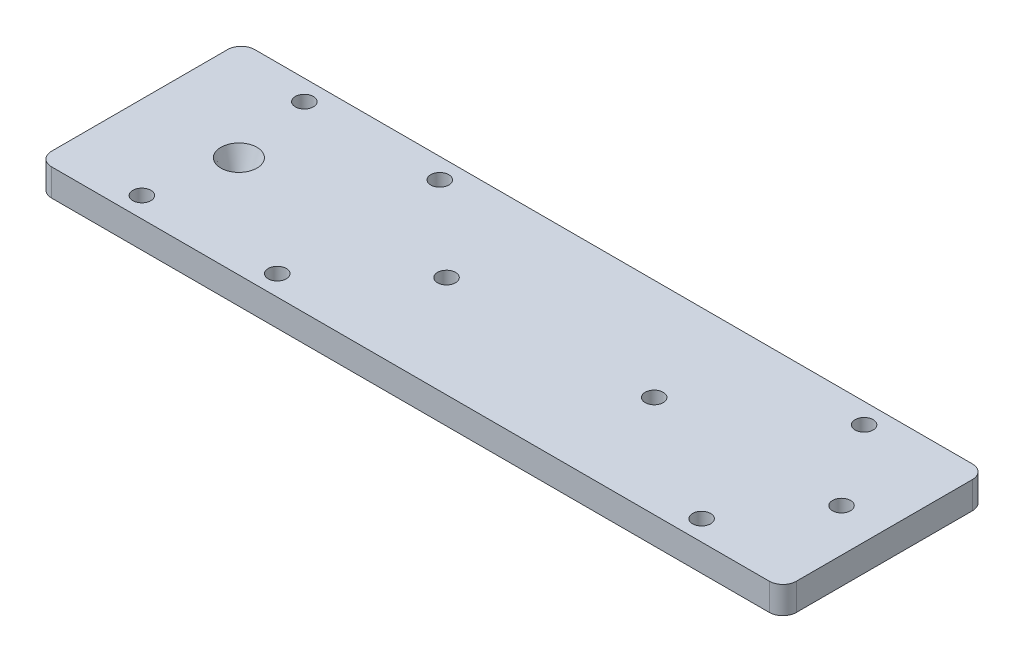
ISO-10303-21;
HEADER;
FILE_DESCRIPTION(('STEP AP214'),'2;1');
FILE_NAME('part.step','',(''),(''),'','','');
FILE_SCHEMA(('AUTOMOTIVE_DESIGN { 1 0 10303 214 1 1 1 1 }'));
ENDSEC;
DATA;
#1=APPLICATION_CONTEXT('core data for automotive mechanical design processes');
#2=APPLICATION_PROTOCOL_DEFINITION('international standard','automotive_design',2000,#1);
#3=PRODUCT_CONTEXT('',#1,'mechanical');
#4=PRODUCT('Part','Part','',(#3));
#5=PRODUCT_RELATED_PRODUCT_CATEGORY('part','',(#4));
#6=PRODUCT_DEFINITION_FORMATION('','',#4);
#7=PRODUCT_DEFINITION_CONTEXT('part definition',#1,'design');
#8=PRODUCT_DEFINITION('design','',#6,#7);
#9=PRODUCT_DEFINITION_SHAPE('','',#8);
#10=(LENGTH_UNIT() NAMED_UNIT(*) SI_UNIT(.MILLI.,.METRE.));
#11=(NAMED_UNIT(*) PLANE_ANGLE_UNIT() SI_UNIT($,.RADIAN.));
#12=(NAMED_UNIT(*) SI_UNIT($,.STERADIAN.) SOLID_ANGLE_UNIT());
#13=UNCERTAINTY_MEASURE_WITH_UNIT(LENGTH_MEASURE(1.E-05),#10,'distance_accuracy_value','');
#14=(GEOMETRIC_REPRESENTATION_CONTEXT(3) GLOBAL_UNCERTAINTY_ASSIGNED_CONTEXT((#13)) GLOBAL_UNIT_ASSIGNED_CONTEXT((#10,
#11,#12)) REPRESENTATION_CONTEXT('',''));
#15=CARTESIAN_POINT('',(0.,0.,0.));
#16=DIRECTION('',(0.,0.,1.));
#17=DIRECTION('',(1.,0.,0.));
#18=AXIS2_PLACEMENT_3D('',#15,#16,#17);
#19=CARTESIAN_POINT('',(0.,3.,-22.5));
#20=DIRECTION('',(0.,0.,-1.));
#21=DIRECTION('',(-1.,0.,0.));
#22=AXIS2_PLACEMENT_3D('',#19,#20,#21);
#23=PLANE('',#22);
#24=DIRECTION('',(1.,0.,0.));
#25=VECTOR('',#24,1.);
#26=CARTESIAN_POINT('',(0.,-3.,-22.5));
#27=LINE('',#26,#25);
#28=CARTESIAN_POINT('',(-79.5,-3.,-22.5));
#29=VERTEX_POINT('',#28);
#30=CARTESIAN_POINT('',(79.5,-3.,-22.5));
#31=VERTEX_POINT('',#30);
#32=EDGE_CURVE('E157',#29,#31,#27,.T.);
#33=ORIENTED_EDGE('',*,*,#32,.F.);
#34=DIRECTION('',(0.,-1.,0.));
#35=VECTOR('',#34,1.);
#36=CARTESIAN_POINT('',(-79.5,3.,-22.5));
#37=LINE('',#36,#35);
#38=CARTESIAN_POINT('',(-79.5,3.,-22.5));
#39=VERTEX_POINT('',#38);
#40=EDGE_CURVE('E11',#39,#29,#37,.T.);
#41=ORIENTED_EDGE('',*,*,#40,.F.);
#42=DIRECTION('',(1.,0.,0.));
#43=VECTOR('',#42,1.);
#44=CARTESIAN_POINT('',(0.,3.,-22.5));
#45=LINE('',#44,#43);
#46=CARTESIAN_POINT('',(79.5,3.,-22.5));
#47=VERTEX_POINT('',#46);
#48=EDGE_CURVE('E303',#39,#47,#45,.T.);
#49=ORIENTED_EDGE('',*,*,#48,.T.);
#50=DIRECTION('',(0.,-1.,0.));
#51=VECTOR('',#50,1.);
#52=CARTESIAN_POINT('',(79.5,3.,-22.5));
#53=LINE('',#52,#51);
#54=EDGE_CURVE('E52',#47,#31,#53,.T.);
#55=ORIENTED_EDGE('',*,*,#54,.T.);
#56=EDGE_LOOP('',(#33,#41,#49,#55));
#57=FACE_BOUND('',#56,.T.);
#58=ADVANCED_FACE('F35',(#57),#23,.T.);
#59=CARTESIAN_POINT('',(-79.5,3.,-19.5));
#60=DIRECTION('',(0.,-1.,0.));
#61=DIRECTION('',(0.,0.,-1.));
#62=AXIS2_PLACEMENT_3D('',#59,#60,#61);
#63=CYLINDRICAL_SURFACE('',#62,3.);
#64=CARTESIAN_POINT('',(-79.5,-3.,-19.5));
#65=DIRECTION('',(0.,1.,0.));
#66=DIRECTION('',(0.,0.,1.));
#67=AXIS2_PLACEMENT_3D('',#64,#65,#66);
#68=CIRCLE('',#67,3.);
#69=CARTESIAN_POINT('',(-82.5,-3.,-19.5));
#70=VERTEX_POINT('',#69);
#71=EDGE_CURVE('E160',#29,#70,#68,.T.);
#72=ORIENTED_EDGE('',*,*,#71,.T.);
#73=DIRECTION('',(0.,-1.,0.));
#74=VECTOR('',#73,1.);
#75=CARTESIAN_POINT('',(-82.5,3.,-19.5));
#76=LINE('',#75,#74);
#77=CARTESIAN_POINT('',(-82.5,3.,-19.5));
#78=VERTEX_POINT('',#77);
#79=EDGE_CURVE('E44',#78,#70,#76,.T.);
#80=ORIENTED_EDGE('',*,*,#79,.F.);
#81=CARTESIAN_POINT('',(-79.5,3.,-19.5));
#82=DIRECTION('',(0.,1.,0.));
#83=DIRECTION('',(0.,0.,1.));
#84=AXIS2_PLACEMENT_3D('',#81,#82,#83);
#85=CIRCLE('',#84,3.);
#86=EDGE_CURVE('E305',#39,#78,#85,.T.);
#87=ORIENTED_EDGE('',*,*,#86,.F.);
#88=ORIENTED_EDGE('',*,*,#40,.T.);
#89=EDGE_LOOP('',(#72,#80,#87,#88));
#90=FACE_BOUND('',#89,.T.);
#91=ADVANCED_FACE('F221',(#90),#63,.T.);
#92=CARTESIAN_POINT('',(-82.5,3.,0.));
#93=DIRECTION('',(1.,0.,0.));
#94=DIRECTION('',(0.,0.,-1.));
#95=AXIS2_PLACEMENT_3D('',#92,#93,#94);
#96=PLANE('',#95);
#97=DIRECTION('',(0.,0.,1.));
#98=VECTOR('',#97,1.);
#99=CARTESIAN_POINT('',(-82.5,-3.,0.));
#100=LINE('',#99,#98);
#101=CARTESIAN_POINT('',(-82.5,-3.,19.5));
#102=VERTEX_POINT('',#101);
#103=EDGE_CURVE('E163',#70,#102,#100,.T.);
#104=ORIENTED_EDGE('',*,*,#103,.T.);
#105=DIRECTION('',(0.,-1.,0.));
#106=VECTOR('',#105,1.);
#107=CARTESIAN_POINT('',(-82.5,3.,19.5));
#108=LINE('',#107,#106);
#109=CARTESIAN_POINT('',(-82.5,3.,19.5));
#110=VERTEX_POINT('',#109);
#111=EDGE_CURVE('E209',#110,#102,#108,.T.);
#112=ORIENTED_EDGE('',*,*,#111,.F.);
#113=DIRECTION('',(0.,0.,1.));
#114=VECTOR('',#113,1.);
#115=CARTESIAN_POINT('',(-82.5,3.,0.));
#116=LINE('',#115,#114);
#117=EDGE_CURVE('E217',#78,#110,#116,.T.);
#118=ORIENTED_EDGE('',*,*,#117,.F.);
#119=ORIENTED_EDGE('',*,*,#79,.T.);
#120=EDGE_LOOP('',(#104,#112,#118,#119));
#121=FACE_BOUND('',#120,.T.);
#122=ADVANCED_FACE('F214',(#121),#96,.F.);
#123=CARTESIAN_POINT('',(-79.5,3.,19.5));
#124=DIRECTION('',(0.,-1.,0.));
#125=DIRECTION('',(0.,0.,-1.));
#126=AXIS2_PLACEMENT_3D('',#123,#124,#125);
#127=CYLINDRICAL_SURFACE('',#126,3.);
#128=CARTESIAN_POINT('',(-79.5,-3.,19.5));
#129=DIRECTION('',(0.,1.,0.));
#130=DIRECTION('',(0.,0.,1.));
#131=AXIS2_PLACEMENT_3D('',#128,#129,#130);
#132=CIRCLE('',#131,3.);
#133=CARTESIAN_POINT('',(-79.5,-3.,22.5));
#134=VERTEX_POINT('',#133);
#135=EDGE_CURVE('E166',#102,#134,#132,.T.);
#136=ORIENTED_EDGE('',*,*,#135,.T.);
#137=DIRECTION('',(0.,-1.,0.));
#138=VECTOR('',#137,1.);
#139=CARTESIAN_POINT('',(-79.5,3.,22.5));
#140=LINE('',#139,#138);
#141=CARTESIAN_POINT('',(-79.5,3.,22.5));
#142=VERTEX_POINT('',#141);
#143=EDGE_CURVE('E206',#142,#134,#140,.T.);
#144=ORIENTED_EDGE('',*,*,#143,.F.);
#145=CARTESIAN_POINT('',(-79.5,3.,19.5));
#146=DIRECTION('',(0.,1.,0.));
#147=DIRECTION('',(0.,0.,1.));
#148=AXIS2_PLACEMENT_3D('',#145,#146,#147);
#149=CIRCLE('',#148,3.);
#150=EDGE_CURVE('E308',#110,#142,#149,.T.);
#151=ORIENTED_EDGE('',*,*,#150,.F.);
#152=ORIENTED_EDGE('',*,*,#111,.T.);
#153=EDGE_LOOP('',(#136,#144,#151,#152));
#154=FACE_BOUND('',#153,.T.);
#155=ADVANCED_FACE('F233',(#154),#127,.T.);
#156=CARTESIAN_POINT('',(0.,3.,22.5));
#157=DIRECTION('',(0.,0.,-1.));
#158=DIRECTION('',(-1.,0.,0.));
#159=AXIS2_PLACEMENT_3D('',#156,#157,#158);
#160=PLANE('',#159);
#161=DIRECTION('',(1.,0.,0.));
#162=VECTOR('',#161,1.);
#163=CARTESIAN_POINT('',(0.,-3.,22.5));
#164=LINE('',#163,#162);
#165=CARTESIAN_POINT('',(79.5,-3.,22.5));
#166=VERTEX_POINT('',#165);
#167=EDGE_CURVE('E169',#134,#166,#164,.T.);
#168=ORIENTED_EDGE('',*,*,#167,.T.);
#169=DIRECTION('',(0.,-1.,0.));
#170=VECTOR('',#169,1.);
#171=CARTESIAN_POINT('',(79.5,3.,22.5));
#172=LINE('',#171,#170);
#173=CARTESIAN_POINT('',(79.5,3.,22.5));
#174=VERTEX_POINT('',#173);
#175=EDGE_CURVE('E122',#174,#166,#172,.T.);
#176=ORIENTED_EDGE('',*,*,#175,.F.);
#177=DIRECTION('',(1.,0.,0.));
#178=VECTOR('',#177,1.);
#179=CARTESIAN_POINT('',(0.,3.,22.5));
#180=LINE('',#179,#178);
#181=EDGE_CURVE('E111',#142,#174,#180,.T.);
#182=ORIENTED_EDGE('',*,*,#181,.F.);
#183=ORIENTED_EDGE('',*,*,#143,.T.);
#184=EDGE_LOOP('',(#168,#176,#182,#183));
#185=FACE_BOUND('',#184,.T.);
#186=ADVANCED_FACE('F236',(#185),#160,.F.);
#187=CARTESIAN_POINT('',(79.5,3.,19.5));
#188=DIRECTION('',(0.,-1.,0.));
#189=DIRECTION('',(0.,0.,-1.));
#190=AXIS2_PLACEMENT_3D('',#187,#188,#189);
#191=CYLINDRICAL_SURFACE('',#190,3.);
#192=CARTESIAN_POINT('',(79.5,-3.,19.5));
#193=DIRECTION('',(0.,1.,0.));
#194=DIRECTION('',(0.,0.,1.));
#195=AXIS2_PLACEMENT_3D('',#192,#193,#194);
#196=CIRCLE('',#195,3.);
#197=CARTESIAN_POINT('',(82.5,-3.,19.5));
#198=VERTEX_POINT('',#197);
#199=EDGE_CURVE('E119',#166,#198,#196,.T.);
#200=ORIENTED_EDGE('',*,*,#199,.T.);
#201=DIRECTION('',(0.,-1.,0.));
#202=VECTOR('',#201,1.);
#203=CARTESIAN_POINT('',(82.5,3.,19.5));
#204=LINE('',#203,#202);
#205=CARTESIAN_POINT('',(82.5,3.,19.5));
#206=VERTEX_POINT('',#205);
#207=EDGE_CURVE('E117',#206,#198,#204,.T.);
#208=ORIENTED_EDGE('',*,*,#207,.F.);
#209=CARTESIAN_POINT('',(79.5,3.,19.5));
#210=DIRECTION('',(0.,1.,0.));
#211=DIRECTION('',(0.,0.,1.));
#212=AXIS2_PLACEMENT_3D('',#209,#210,#211);
#213=CIRCLE('',#212,3.);
#214=EDGE_CURVE('E102',#174,#206,#213,.T.);
#215=ORIENTED_EDGE('',*,*,#214,.F.);
#216=ORIENTED_EDGE('',*,*,#175,.T.);
#217=EDGE_LOOP('',(#200,#208,#215,#216));
#218=FACE_BOUND('',#217,.T.);
#219=ADVANCED_FACE('F118',(#218),#191,.T.);
#220=CARTESIAN_POINT('',(82.5,3.,0.));
#221=DIRECTION('',(1.,0.,0.));
#222=DIRECTION('',(0.,0.,-1.));
#223=AXIS2_PLACEMENT_3D('',#220,#221,#222);
#224=PLANE('',#223);
#225=DIRECTION('',(0.,0.,1.));
#226=VECTOR('',#225,1.);
#227=CARTESIAN_POINT('',(82.5,-3.,0.));
#228=LINE('',#227,#226);
#229=CARTESIAN_POINT('',(82.5,-3.,-19.5));
#230=VERTEX_POINT('',#229);
#231=EDGE_CURVE('E173',#230,#198,#228,.T.);
#232=ORIENTED_EDGE('',*,*,#231,.F.);
#233=DIRECTION('',(0.,-1.,0.));
#234=VECTOR('',#233,1.);
#235=CARTESIAN_POINT('',(82.5,3.,-19.5));
#236=LINE('',#235,#234);
#237=CARTESIAN_POINT('',(82.5,3.,-19.5));
#238=VERTEX_POINT('',#237);
#239=EDGE_CURVE('E77',#238,#230,#236,.T.);
#240=ORIENTED_EDGE('',*,*,#239,.F.);
#241=DIRECTION('',(0.,0.,1.));
#242=VECTOR('',#241,1.);
#243=CARTESIAN_POINT('',(82.5,3.,0.));
#244=LINE('',#243,#242);
#245=EDGE_CURVE('E109',#238,#206,#244,.T.);
#246=ORIENTED_EDGE('',*,*,#245,.T.);
#247=ORIENTED_EDGE('',*,*,#207,.T.);
#248=EDGE_LOOP('',(#232,#240,#246,#247));
#249=FACE_BOUND('',#248,.T.);
#250=ADVANCED_FACE('F124',(#249),#224,.T.);
#251=CARTESIAN_POINT('',(60.,3.,18.));
#252=DIRECTION('',(0.,-1.,0.));
#253=DIRECTION('',(0.,0.,-1.));
#254=AXIS2_PLACEMENT_3D('',#251,#252,#253);
#255=CYLINDRICAL_SURFACE('',#254,2.);
#256=CARTESIAN_POINT('',(60.,3.,18.));
#257=DIRECTION('',(0.,1.,0.));
#258=DIRECTION('',(0.,0.,1.));
#259=AXIS2_PLACEMENT_3D('',#256,#257,#258);
#260=CIRCLE('',#259,2.);
#261=CARTESIAN_POINT('',(60.,3.,20.));
#262=VERTEX_POINT('',#261);
#263=EDGE_CURVE('E148',#262,#262,#260,.F.);
#264=ORIENTED_EDGE('',*,*,#263,.F.);
#265=EDGE_LOOP('',(#264));
#266=FACE_BOUND('',#265,.T.);
#267=CARTESIAN_POINT('',(60.,-3.,18.));
#268=DIRECTION('',(0.,1.,0.));
#269=DIRECTION('',(0.,0.,1.));
#270=AXIS2_PLACEMENT_3D('',#267,#268,#269);
#271=CIRCLE('',#270,2.);
#272=CARTESIAN_POINT('',(60.,-3.,20.));
#273=VERTEX_POINT('',#272);
#274=EDGE_CURVE('E196',#273,#273,#271,.F.);
#275=ORIENTED_EDGE('',*,*,#274,.T.);
#276=EDGE_LOOP('',(#275));
#277=FACE_BOUND('',#276,.T.);
#278=ADVANCED_FACE('F245',(#266,#277),#255,.F.);
#279=CARTESIAN_POINT('',(73.,3.,0.));
#280=DIRECTION('',(0.,-1.,0.));
#281=DIRECTION('',(0.,0.,-1.));
#282=AXIS2_PLACEMENT_3D('',#279,#280,#281);
#283=CYLINDRICAL_SURFACE('',#282,2.);
#284=CARTESIAN_POINT('',(73.,3.,0.));
#285=DIRECTION('',(0.,1.,0.));
#286=DIRECTION('',(0.,0.,1.));
#287=AXIS2_PLACEMENT_3D('',#284,#285,#286);
#288=CIRCLE('',#287,2.);
#289=CARTESIAN_POINT('',(73.,3.,2.));
#290=VERTEX_POINT('',#289);
#291=EDGE_CURVE('E145',#290,#290,#288,.T.);
#292=ORIENTED_EDGE('',*,*,#291,.T.);
#293=EDGE_LOOP('',(#292));
#294=FACE_BOUND('',#293,.T.);
#295=CARTESIAN_POINT('',(73.,-3.,0.));
#296=DIRECTION('',(0.,1.,0.));
#297=DIRECTION('',(0.,0.,1.));
#298=AXIS2_PLACEMENT_3D('',#295,#296,#297);
#299=CIRCLE('',#298,2.);
#300=CARTESIAN_POINT('',(73.,-3.,2.));
#301=VERTEX_POINT('',#300);
#302=EDGE_CURVE('E193',#301,#301,#299,.T.);
#303=ORIENTED_EDGE('',*,*,#302,.F.);
#304=EDGE_LOOP('',(#303));
#305=FACE_BOUND('',#304,.T.);
#306=ADVANCED_FACE('F268',(#294,#305),#283,.F.);
#307=CARTESIAN_POINT('',(31.5,3.,0.));
#308=DIRECTION('',(0.,-1.,0.));
#309=DIRECTION('',(0.,0.,-1.));
#310=AXIS2_PLACEMENT_3D('',#307,#308,#309);
#311=CYLINDRICAL_SURFACE('',#310,2.);
#312=CARTESIAN_POINT('',(31.5,3.,0.));
#313=DIRECTION('',(0.,1.,0.));
#314=DIRECTION('',(0.,0.,1.));
#315=AXIS2_PLACEMENT_3D('',#312,#313,#314);
#316=CIRCLE('',#315,2.);
#317=CARTESIAN_POINT('',(31.5,3.,2.));
#318=VERTEX_POINT('',#317);
#319=EDGE_CURVE('E142',#318,#318,#316,.T.);
#320=ORIENTED_EDGE('',*,*,#319,.T.);
#321=EDGE_LOOP('',(#320));
#322=FACE_BOUND('',#321,.T.);
#323=CARTESIAN_POINT('',(31.5,-3.,0.));
#324=DIRECTION('',(0.,1.,0.));
#325=DIRECTION('',(0.,0.,1.));
#326=AXIS2_PLACEMENT_3D('',#323,#324,#325);
#327=CIRCLE('',#326,2.);
#328=CARTESIAN_POINT('',(31.5,-3.,2.));
#329=VERTEX_POINT('',#328);
#330=EDGE_CURVE('E190',#329,#329,#327,.T.);
#331=ORIENTED_EDGE('',*,*,#330,.F.);
#332=EDGE_LOOP('',(#331));
#333=FACE_BOUND('',#332,.T.);
#334=ADVANCED_FACE('F264',(#322,#333),#311,.F.);
#335=CARTESIAN_POINT('',(-14.5,3.,0.));
#336=DIRECTION('',(0.,-1.,0.));
#337=DIRECTION('',(0.,0.,-1.));
#338=AXIS2_PLACEMENT_3D('',#335,#336,#337);
#339=CYLINDRICAL_SURFACE('',#338,2.);
#340=CARTESIAN_POINT('',(-14.5,3.,0.));
#341=DIRECTION('',(0.,1.,0.));
#342=DIRECTION('',(0.,0.,1.));
#343=AXIS2_PLACEMENT_3D('',#340,#341,#342);
#344=CIRCLE('',#343,2.);
#345=CARTESIAN_POINT('',(-14.5,3.,2.));
#346=VERTEX_POINT('',#345);
#347=EDGE_CURVE('E139',#346,#346,#344,.T.);
#348=ORIENTED_EDGE('',*,*,#347,.T.);
#349=EDGE_LOOP('',(#348));
#350=FACE_BOUND('',#349,.T.);
#351=CARTESIAN_POINT('',(-14.5,-3.,0.));
#352=DIRECTION('',(0.,1.,0.));
#353=DIRECTION('',(0.,0.,1.));
#354=AXIS2_PLACEMENT_3D('',#351,#352,#353);
#355=CIRCLE('',#354,2.);
#356=CARTESIAN_POINT('',(-14.5,-3.,2.));
#357=VERTEX_POINT('',#356);
#358=EDGE_CURVE('E187',#357,#357,#355,.T.);
#359=ORIENTED_EDGE('',*,*,#358,.F.);
#360=EDGE_LOOP('',(#359));
#361=FACE_BOUND('',#360,.T.);
#362=ADVANCED_FACE('F260',(#350,#361),#339,.F.);
#363=CARTESIAN_POINT('',(60.,3.,-18.));
#364=DIRECTION('',(0.,-1.,0.));
#365=DIRECTION('',(0.,0.,-1.));
#366=AXIS2_PLACEMENT_3D('',#363,#364,#365);
#367=CYLINDRICAL_SURFACE('',#366,2.);
#368=CARTESIAN_POINT('',(60.,3.,-18.));
#369=DIRECTION('',(0.,1.,0.));
#370=DIRECTION('',(0.,0.,1.));
#371=AXIS2_PLACEMENT_3D('',#368,#369,#370);
#372=CIRCLE('',#371,2.);
#373=CARTESIAN_POINT('',(60.,3.,-16.));
#374=VERTEX_POINT('',#373);
#375=EDGE_CURVE('E136',#374,#374,#372,.T.);
#376=ORIENTED_EDGE('',*,*,#375,.T.);
#377=EDGE_LOOP('',(#376));
#378=FACE_BOUND('',#377,.T.);
#379=CARTESIAN_POINT('',(60.,-3.,-18.));
#380=DIRECTION('',(0.,1.,0.));
#381=DIRECTION('',(0.,0.,1.));
#382=AXIS2_PLACEMENT_3D('',#379,#380,#381);
#383=CIRCLE('',#382,2.);
#384=CARTESIAN_POINT('',(60.,-3.,-16.));
#385=VERTEX_POINT('',#384);
#386=EDGE_CURVE('E184',#385,#385,#383,.T.);
#387=ORIENTED_EDGE('',*,*,#386,.F.);
#388=EDGE_LOOP('',(#387));
#389=FACE_BOUND('',#388,.T.);
#390=ADVANCED_FACE('F256',(#378,#389),#367,.F.);
#391=CARTESIAN_POINT('',(-34.,3.,-18.));
#392=DIRECTION('',(0.,-1.,0.));
#393=DIRECTION('',(0.,0.,-1.));
#394=AXIS2_PLACEMENT_3D('',#391,#392,#393);
#395=CYLINDRICAL_SURFACE('',#394,2.);
#396=CARTESIAN_POINT('',(-34.,3.,-18.));
#397=DIRECTION('',(0.,1.,0.));
#398=DIRECTION('',(0.,0.,1.));
#399=AXIS2_PLACEMENT_3D('',#396,#397,#398);
#400=CIRCLE('',#399,2.);
#401=CARTESIAN_POINT('',(-34.,3.,-16.));
#402=VERTEX_POINT('',#401);
#403=EDGE_CURVE('E133',#402,#402,#400,.T.);
#404=ORIENTED_EDGE('',*,*,#403,.T.);
#405=EDGE_LOOP('',(#404));
#406=FACE_BOUND('',#405,.T.);
#407=CARTESIAN_POINT('',(-34.,-3.,-18.));
#408=DIRECTION('',(0.,1.,0.));
#409=DIRECTION('',(0.,0.,1.));
#410=AXIS2_PLACEMENT_3D('',#407,#408,#409);
#411=CIRCLE('',#410,2.);
#412=CARTESIAN_POINT('',(-34.,-3.,-16.));
#413=VERTEX_POINT('',#412);
#414=EDGE_CURVE('E181',#413,#413,#411,.T.);
#415=ORIENTED_EDGE('',*,*,#414,.F.);
#416=EDGE_LOOP('',(#415));
#417=FACE_BOUND('',#416,.T.);
#418=ADVANCED_FACE('F252',(#406,#417),#395,.F.);
#419=CARTESIAN_POINT('',(-64.,3.,-18.));
#420=DIRECTION('',(0.,-1.,0.));
#421=DIRECTION('',(0.,0.,-1.));
#422=AXIS2_PLACEMENT_3D('',#419,#420,#421);
#423=CYLINDRICAL_SURFACE('',#422,2.);
#424=CARTESIAN_POINT('',(-64.,3.,-18.));
#425=DIRECTION('',(0.,1.,0.));
#426=DIRECTION('',(0.,0.,1.));
#427=AXIS2_PLACEMENT_3D('',#424,#425,#426);
#428=CIRCLE('',#427,2.);
#429=CARTESIAN_POINT('',(-64.,3.,-16.));
#430=VERTEX_POINT('',#429);
#431=EDGE_CURVE('E127',#430,#430,#428,.T.);
#432=ORIENTED_EDGE('',*,*,#431,.T.);
#433=EDGE_LOOP('',(#432));
#434=FACE_BOUND('',#433,.T.);
#435=CARTESIAN_POINT('',(-64.,-3.,-18.));
#436=DIRECTION('',(0.,1.,0.));
#437=DIRECTION('',(0.,0.,1.));
#438=AXIS2_PLACEMENT_3D('',#435,#436,#437);
#439=CIRCLE('',#438,2.);
#440=CARTESIAN_POINT('',(-64.,-3.,-16.));
#441=VERTEX_POINT('',#440);
#442=EDGE_CURVE('E178',#441,#441,#439,.T.);
#443=ORIENTED_EDGE('',*,*,#442,.F.);
#444=EDGE_LOOP('',(#443));
#445=FACE_BOUND('',#444,.T.);
#446=ADVANCED_FACE('F249',(#434,#445),#423,.F.);
#447=CARTESIAN_POINT('',(79.5,3.,-19.5));
#448=DIRECTION('',(0.,-1.,0.));
#449=DIRECTION('',(0.,0.,-1.));
#450=AXIS2_PLACEMENT_3D('',#447,#448,#449);
#451=CYLINDRICAL_SURFACE('',#450,3.);
#452=CARTESIAN_POINT('',(79.5,-3.,-19.5));
#453=DIRECTION('',(0.,1.,0.));
#454=DIRECTION('',(0.,0.,1.));
#455=AXIS2_PLACEMENT_3D('',#452,#453,#454);
#456=CIRCLE('',#455,3.);
#457=EDGE_CURVE('E175',#31,#230,#456,.F.);
#458=ORIENTED_EDGE('',*,*,#457,.F.);
#459=ORIENTED_EDGE('',*,*,#54,.F.);
#460=CARTESIAN_POINT('',(79.5,3.,-19.5));
#461=DIRECTION('',(0.,1.,0.));
#462=DIRECTION('',(0.,0.,1.));
#463=AXIS2_PLACEMENT_3D('',#460,#461,#462);
#464=CIRCLE('',#463,3.);
#465=EDGE_CURVE('E125',#47,#238,#464,.F.);
#466=ORIENTED_EDGE('',*,*,#465,.T.);
#467=ORIENTED_EDGE('',*,*,#239,.T.);
#468=EDGE_LOOP('',(#458,#459,#466,#467));
#469=FACE_BOUND('',#468,.T.);
#470=ADVANCED_FACE('F246',(#469),#451,.T.);
#471=CARTESIAN_POINT('',(-34.,3.,18.));
#472=DIRECTION('',(0.,-1.,0.));
#473=DIRECTION('',(0.,0.,-1.));
#474=AXIS2_PLACEMENT_3D('',#471,#472,#473);
#475=CYLINDRICAL_SURFACE('',#474,2.);
#476=CARTESIAN_POINT('',(-34.,3.,18.));
#477=DIRECTION('',(0.,1.,0.));
#478=DIRECTION('',(0.,0.,1.));
#479=AXIS2_PLACEMENT_3D('',#476,#477,#478);
#480=CIRCLE('',#479,2.);
#481=CARTESIAN_POINT('',(-34.,3.,20.));
#482=VERTEX_POINT('',#481);
#483=EDGE_CURVE('E202',#482,#482,#480,.F.);
#484=ORIENTED_EDGE('',*,*,#483,.F.);
#485=EDGE_LOOP('',(#484));
#486=FACE_BOUND('',#485,.T.);
#487=CARTESIAN_POINT('',(-34.,-3.,18.));
#488=DIRECTION('',(0.,1.,0.));
#489=DIRECTION('',(0.,0.,1.));
#490=AXIS2_PLACEMENT_3D('',#487,#488,#489);
#491=CIRCLE('',#490,2.);
#492=CARTESIAN_POINT('',(-34.,-3.,20.));
#493=VERTEX_POINT('',#492);
#494=EDGE_CURVE('E154',#493,#493,#491,.F.);
#495=ORIENTED_EDGE('',*,*,#494,.T.);
#496=EDGE_LOOP('',(#495));
#497=FACE_BOUND('',#496,.T.);
#498=ADVANCED_FACE('F37',(#486,#497),#475,.F.);
#499=CARTESIAN_POINT('',(-64.,3.,18.));
#500=DIRECTION('',(0.,-1.,0.));
#501=DIRECTION('',(0.,0.,-1.));
#502=AXIS2_PLACEMENT_3D('',#499,#500,#501);
#503=CYLINDRICAL_SURFACE('',#502,2.);
#504=CARTESIAN_POINT('',(-64.,3.,18.));
#505=DIRECTION('',(0.,1.,0.));
#506=DIRECTION('',(0.,0.,1.));
#507=AXIS2_PLACEMENT_3D('',#504,#505,#506);
#508=CIRCLE('',#507,2.);
#509=CARTESIAN_POINT('',(-64.,3.,20.));
#510=VERTEX_POINT('',#509);
#511=EDGE_CURVE('E151',#510,#510,#508,.F.);
#512=ORIENTED_EDGE('',*,*,#511,.F.);
#513=EDGE_LOOP('',(#512));
#514=FACE_BOUND('',#513,.T.);
#515=CARTESIAN_POINT('',(-64.,-3.,18.));
#516=DIRECTION('',(0.,1.,0.));
#517=DIRECTION('',(0.,0.,1.));
#518=AXIS2_PLACEMENT_3D('',#515,#516,#517);
#519=CIRCLE('',#518,2.);
#520=CARTESIAN_POINT('',(-64.,-3.,20.));
#521=VERTEX_POINT('',#520);
#522=EDGE_CURVE('E199',#521,#521,#519,.F.);
#523=ORIENTED_EDGE('',*,*,#522,.T.);
#524=EDGE_LOOP('',(#523));
#525=FACE_BOUND('',#524,.T.);
#526=ADVANCED_FACE('F276',(#514,#525),#503,.F.);
#527=CARTESIAN_POINT('',(0.,3.,0.));
#528=DIRECTION('',(0.,1.,0.));
#529=DIRECTION('',(0.,0.,1.));
#530=AXIS2_PLACEMENT_3D('',#527,#528,#529);
#531=PLANE('',#530);
#532=CARTESIAN_POINT('',(-60.5,3.,0.));
#533=DIRECTION('',(0.,1.,0.));
#534=DIRECTION('',(-1.,0.,0.));
#535=AXIS2_PLACEMENT_3D('',#532,#533,#534);
#536=CIRCLE('',#535,4.);
#537=CARTESIAN_POINT('',(-64.5,3.,0.));
#538=VERTEX_POINT('',#537);
#539=EDGE_CURVE('E158',#538,#538,#536,.T.);
#540=ORIENTED_EDGE('',*,*,#539,.F.);
#541=EDGE_LOOP('',(#540));
#542=FACE_BOUND('',#541,.T.);
#543=ORIENTED_EDGE('',*,*,#483,.T.);
#544=EDGE_LOOP('',(#543));
#545=FACE_BOUND('',#544,.T.);
#546=ORIENTED_EDGE('',*,*,#48,.F.);
#547=ORIENTED_EDGE('',*,*,#86,.T.);
#548=ORIENTED_EDGE('',*,*,#117,.T.);
#549=ORIENTED_EDGE('',*,*,#150,.T.);
#550=ORIENTED_EDGE('',*,*,#181,.T.);
#551=ORIENTED_EDGE('',*,*,#214,.T.);
#552=ORIENTED_EDGE('',*,*,#245,.F.);
#553=ORIENTED_EDGE('',*,*,#465,.F.);
#554=EDGE_LOOP('',(#546,#547,#548,#549,#550,#551,#552,#553));
#555=FACE_BOUND('',#554,.T.);
#556=ORIENTED_EDGE('',*,*,#431,.F.);
#557=EDGE_LOOP('',(#556));
#558=FACE_BOUND('',#557,.T.);
#559=ORIENTED_EDGE('',*,*,#403,.F.);
#560=EDGE_LOOP('',(#559));
#561=FACE_BOUND('',#560,.T.);
#562=ORIENTED_EDGE('',*,*,#375,.F.);
#563=EDGE_LOOP('',(#562));
#564=FACE_BOUND('',#563,.T.);
#565=ORIENTED_EDGE('',*,*,#347,.F.);
#566=EDGE_LOOP('',(#565));
#567=FACE_BOUND('',#566,.T.);
#568=ORIENTED_EDGE('',*,*,#319,.F.);
#569=EDGE_LOOP('',(#568));
#570=FACE_BOUND('',#569,.T.);
#571=ORIENTED_EDGE('',*,*,#291,.F.);
#572=EDGE_LOOP('',(#571));
#573=FACE_BOUND('',#572,.T.);
#574=ORIENTED_EDGE('',*,*,#263,.T.);
#575=EDGE_LOOP('',(#574));
#576=FACE_BOUND('',#575,.T.);
#577=ORIENTED_EDGE('',*,*,#511,.T.);
#578=EDGE_LOOP('',(#577));
#579=FACE_BOUND('',#578,.T.);
#580=ADVANCED_FACE('F105',(#542,#545,#555,#558,#561,#564,#567,#570,#573,#576,#579),#531,.T.);
#581=CARTESIAN_POINT('',(0.,-3.,0.));
#582=DIRECTION('',(0.,1.,0.));
#583=DIRECTION('',(0.,0.,1.));
#584=AXIS2_PLACEMENT_3D('',#581,#582,#583);
#585=PLANE('',#584);
#586=ORIENTED_EDGE('',*,*,#494,.F.);
#587=EDGE_LOOP('',(#586));
#588=FACE_BOUND('',#587,.T.);
#589=ORIENTED_EDGE('',*,*,#32,.T.);
#590=ORIENTED_EDGE('',*,*,#457,.T.);
#591=ORIENTED_EDGE('',*,*,#231,.T.);
#592=ORIENTED_EDGE('',*,*,#199,.F.);
#593=ORIENTED_EDGE('',*,*,#167,.F.);
#594=ORIENTED_EDGE('',*,*,#135,.F.);
#595=ORIENTED_EDGE('',*,*,#103,.F.);
#596=ORIENTED_EDGE('',*,*,#71,.F.);
#597=EDGE_LOOP('',(#589,#590,#591,#592,#593,#594,#595,#596));
#598=FACE_BOUND('',#597,.T.);
#599=ORIENTED_EDGE('',*,*,#442,.T.);
#600=EDGE_LOOP('',(#599));
#601=FACE_BOUND('',#600,.T.);
#602=ORIENTED_EDGE('',*,*,#414,.T.);
#603=EDGE_LOOP('',(#602));
#604=FACE_BOUND('',#603,.T.);
#605=ORIENTED_EDGE('',*,*,#386,.T.);
#606=EDGE_LOOP('',(#605));
#607=FACE_BOUND('',#606,.T.);
#608=CARTESIAN_POINT('',(-60.5,-3.,0.));
#609=DIRECTION('',(0.,1.,0.));
#610=DIRECTION('',(-1.,0.,0.));
#611=AXIS2_PLACEMENT_3D('',#608,#609,#610);
#612=CIRCLE('',#611,2.);
#613=CARTESIAN_POINT('',(-62.5,-3.,0.));
#614=VERTEX_POINT('',#613);
#615=EDGE_CURVE('E296',#614,#614,#612,.T.);
#616=ORIENTED_EDGE('',*,*,#615,.T.);
#617=EDGE_LOOP('',(#616));
#618=FACE_BOUND('',#617,.T.);
#619=ORIENTED_EDGE('',*,*,#358,.T.);
#620=EDGE_LOOP('',(#619));
#621=FACE_BOUND('',#620,.T.);
#622=ORIENTED_EDGE('',*,*,#330,.T.);
#623=EDGE_LOOP('',(#622));
#624=FACE_BOUND('',#623,.T.);
#625=ORIENTED_EDGE('',*,*,#302,.T.);
#626=EDGE_LOOP('',(#625));
#627=FACE_BOUND('',#626,.T.);
#628=ORIENTED_EDGE('',*,*,#274,.F.);
#629=EDGE_LOOP('',(#628));
#630=FACE_BOUND('',#629,.T.);
#631=ORIENTED_EDGE('',*,*,#522,.F.);
#632=EDGE_LOOP('',(#631));
#633=FACE_BOUND('',#632,.T.);
#634=ADVANCED_FACE('F223',(#588,#598,#601,#604,#607,#618,#621,#624,#627,#630,#633),#585,.F.);
#635=CARTESIAN_POINT('',(-60.5,-3.,0.));
#636=DIRECTION('',(0.,1.,0.));
#637=DIRECTION('',(-1.,0.,0.));
#638=AXIS2_PLACEMENT_3D('',#635,#636,#637);
#639=CONICAL_SURFACE('',#638,2.,0.321750554396641);
#640=ORIENTED_EDGE('',*,*,#539,.T.);
#641=EDGE_LOOP('',(#640));
#642=FACE_BOUND('',#641,.T.);
#643=ORIENTED_EDGE('',*,*,#615,.F.);
#644=EDGE_LOOP('',(#643));
#645=FACE_BOUND('',#644,.T.);
#646=ADVANCED_FACE('F282',(#642,#645),#639,.F.);
#647=CLOSED_SHELL('',(#58,#91,#122,#155,#186,#219,#250,#278,#306,#334,#362,#390,#418,#446,#470,
#498,#526,#580,#634,#646));
#648=MANIFOLD_SOLID_BREP('B2',#647);
#649=ADVANCED_BREP_SHAPE_REPRESENTATION('',(#18,#648),#14);
#650=SHAPE_DEFINITION_REPRESENTATION(#9,#649);
ENDSEC;
END-ISO-10303-21;
